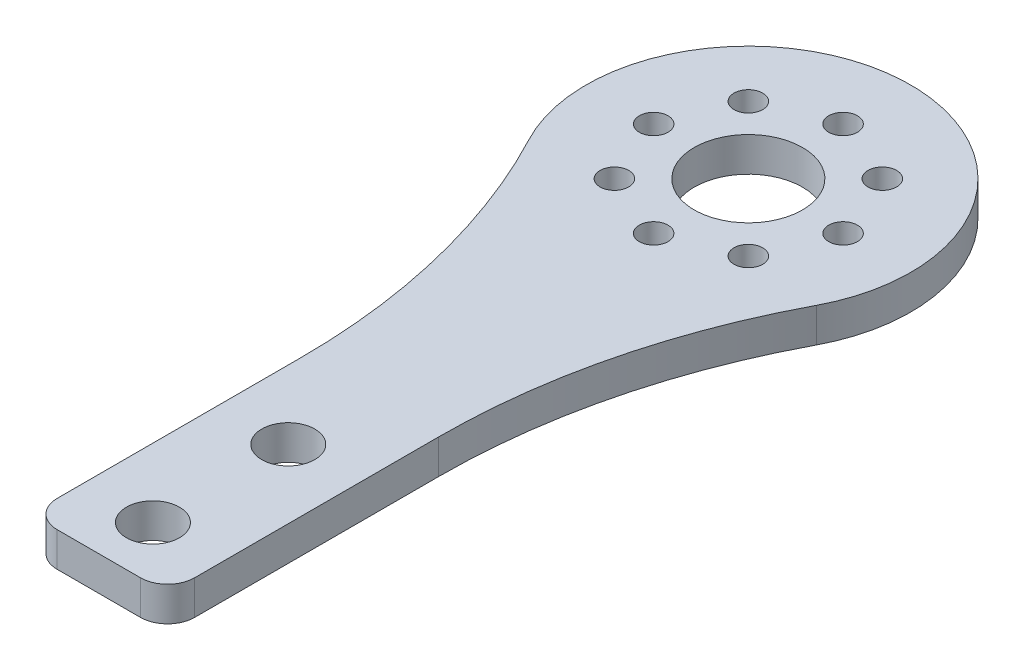
ISO-10303-21;
HEADER;
FILE_DESCRIPTION(('STEP AP214'),'2;1');
FILE_NAME('part.step','',(''),(''),'','','');
FILE_SCHEMA(('AUTOMOTIVE_DESIGN { 1 0 10303 214 1 1 1 1 }'));
ENDSEC;
DATA;
#1=APPLICATION_CONTEXT('core data for automotive mechanical design processes');
#2=APPLICATION_PROTOCOL_DEFINITION('international standard','automotive_design',2000,#1);
#3=PRODUCT_CONTEXT('',#1,'mechanical');
#4=PRODUCT('Part','Part','',(#3));
#5=PRODUCT_RELATED_PRODUCT_CATEGORY('part','',(#4));
#6=PRODUCT_DEFINITION_FORMATION('','',#4);
#7=PRODUCT_DEFINITION_CONTEXT('part definition',#1,'design');
#8=PRODUCT_DEFINITION('design','',#6,#7);
#9=PRODUCT_DEFINITION_SHAPE('','',#8);
#10=(LENGTH_UNIT() NAMED_UNIT(*) SI_UNIT(.MILLI.,.METRE.));
#11=(NAMED_UNIT(*) PLANE_ANGLE_UNIT() SI_UNIT($,.RADIAN.));
#12=(NAMED_UNIT(*) SI_UNIT($,.STERADIAN.) SOLID_ANGLE_UNIT());
#13=UNCERTAINTY_MEASURE_WITH_UNIT(LENGTH_MEASURE(1.E-05),#10,'distance_accuracy_value','');
#14=(GEOMETRIC_REPRESENTATION_CONTEXT(3) GLOBAL_UNCERTAINTY_ASSIGNED_CONTEXT((#13)) GLOBAL_UNIT_ASSIGNED_CONTEXT((#10,
#11,#12)) REPRESENTATION_CONTEXT('',''));
#15=CARTESIAN_POINT('',(0.,0.,0.));
#16=DIRECTION('',(0.,0.,1.));
#17=DIRECTION('',(1.,0.,0.));
#18=AXIS2_PLACEMENT_3D('',#15,#16,#17);
#19=CARTESIAN_POINT('',(0.,0.,0.));
#20=DIRECTION('',(0.,1.,0.));
#21=DIRECTION('',(0.,0.,1.));
#22=AXIS2_PLACEMENT_3D('',#19,#20,#21);
#23=PLANE('',#22);
#24=CARTESIAN_POINT('',(0.,0.,85.));
#25=DIRECTION('',(0.,-1.,0.));
#26=DIRECTION('',(0.,0.,-1.));
#27=AXIS2_PLACEMENT_3D('',#24,#25,#26);
#28=CIRCLE('',#27,4.9022);
#29=CARTESIAN_POINT('',(0.,0.,80.0978));
#30=VERTEX_POINT('',#29);
#31=EDGE_CURVE('E428',#30,#30,#28,.T.);
#32=ORIENTED_EDGE('',*,*,#31,.F.);
#33=EDGE_LOOP('',(#32));
#34=FACE_BOUND('',#33,.T.);
#35=CARTESIAN_POINT('',(0.,0.,110.));
#36=DIRECTION('',(0.,-1.,0.));
#37=DIRECTION('',(0.,0.,-1.));
#38=AXIS2_PLACEMENT_3D('',#35,#36,#37);
#39=CIRCLE('',#38,4.9022);
#40=CARTESIAN_POINT('',(0.,0.,105.0978));
#41=VERTEX_POINT('',#40);
#42=EDGE_CURVE('E430',#41,#41,#39,.T.);
#43=ORIENTED_EDGE('',*,*,#42,.F.);
#44=EDGE_LOOP('',(#43));
#45=FACE_BOUND('',#44,.T.);
#46=CARTESIAN_POINT('',(0.,0.,0.));
#47=DIRECTION('',(0.,-1.,0.));
#48=DIRECTION('',(0.,0.,-1.));
#49=AXIS2_PLACEMENT_3D('',#46,#47,#48);
#50=CIRCLE('',#49,10.);
#51=CARTESIAN_POINT('',(0.,0.,-10.));
#52=VERTEX_POINT('',#51);
#53=EDGE_CURVE('E438',#52,#52,#50,.T.);
#54=ORIENTED_EDGE('',*,*,#53,.F.);
#55=EDGE_LOOP('',(#54));
#56=FACE_BOUND('',#55,.T.);
#57=CARTESIAN_POINT('',(0.,0.,-17.5));
#58=DIRECTION('',(0.,-1.,0.));
#59=DIRECTION('',(0.,0.,-1.));
#60=AXIS2_PLACEMENT_3D('',#57,#58,#59);
#61=CIRCLE('',#60,2.65);
#62=CARTESIAN_POINT('',(0.,0.,-20.15));
#63=VERTEX_POINT('',#62);
#64=EDGE_CURVE('E442',#63,#63,#61,.T.);
#65=ORIENTED_EDGE('',*,*,#64,.F.);
#66=EDGE_LOOP('',(#65));
#67=FACE_BOUND('',#66,.T.);
#68=CARTESIAN_POINT('',(-12.3743686707646,0.,-12.3743686707646));
#69=DIRECTION('',(0.,-1.,0.));
#70=DIRECTION('',(0.,0.,-1.));
#71=AXIS2_PLACEMENT_3D('',#68,#69,#70);
#72=CIRCLE('',#71,2.65);
#73=CARTESIAN_POINT('',(-12.3743686707646,0.,-15.0243686707646));
#74=VERTEX_POINT('',#73);
#75=EDGE_CURVE('E450',#74,#74,#72,.T.);
#76=ORIENTED_EDGE('',*,*,#75,.F.);
#77=EDGE_LOOP('',(#76));
#78=FACE_BOUND('',#77,.T.);
#79=CARTESIAN_POINT('',(-12.3743686707646,0.,12.3743686707646));
#80=DIRECTION('',(0.,-1.,0.));
#81=DIRECTION('',(0.,0.,-1.));
#82=AXIS2_PLACEMENT_3D('',#79,#80,#81);
#83=CIRCLE('',#82,2.65);
#84=CARTESIAN_POINT('',(-12.3743686707646,0.,9.72436867076458));
#85=VERTEX_POINT('',#84);
#86=EDGE_CURVE('E462',#85,#85,#83,.T.);
#87=ORIENTED_EDGE('',*,*,#86,.F.);
#88=EDGE_LOOP('',(#87));
#89=FACE_BOUND('',#88,.T.);
#90=CARTESIAN_POINT('',(0.,0.,17.5));
#91=DIRECTION('',(0.,-1.,0.));
#92=DIRECTION('',(0.,0.,-1.));
#93=AXIS2_PLACEMENT_3D('',#90,#91,#92);
#94=CIRCLE('',#93,2.65);
#95=CARTESIAN_POINT('',(0.,0.,14.85));
#96=VERTEX_POINT('',#95);
#97=EDGE_CURVE('E468',#96,#96,#94,.T.);
#98=ORIENTED_EDGE('',*,*,#97,.F.);
#99=EDGE_LOOP('',(#98));
#100=FACE_BOUND('',#99,.T.);
#101=CARTESIAN_POINT('',(12.3743686707646,0.,12.3743686707646));
#102=DIRECTION('',(0.,-1.,0.));
#103=DIRECTION('',(0.,0.,-1.));
#104=AXIS2_PLACEMENT_3D('',#101,#102,#103);
#105=CIRCLE('',#104,2.65);
#106=CARTESIAN_POINT('',(12.3743686707646,0.,9.72436867076458));
#107=VERTEX_POINT('',#106);
#108=EDGE_CURVE('E474',#107,#107,#105,.T.);
#109=ORIENTED_EDGE('',*,*,#108,.F.);
#110=EDGE_LOOP('',(#109));
#111=FACE_BOUND('',#110,.T.);
#112=CARTESIAN_POINT('',(17.5,0.,0.));
#113=DIRECTION('',(0.,-1.,0.));
#114=DIRECTION('',(0.,0.,-1.));
#115=AXIS2_PLACEMENT_3D('',#112,#113,#114);
#116=CIRCLE('',#115,2.65);
#117=CARTESIAN_POINT('',(17.5,0.,-2.65));
#118=VERTEX_POINT('',#117);
#119=EDGE_CURVE('E480',#118,#118,#116,.T.);
#120=ORIENTED_EDGE('',*,*,#119,.F.);
#121=EDGE_LOOP('',(#120));
#122=FACE_BOUND('',#121,.T.);
#123=CARTESIAN_POINT('',(12.3743686707646,0.,-12.3743686707646));
#124=DIRECTION('',(0.,-1.,0.));
#125=DIRECTION('',(0.,0.,-1.));
#126=AXIS2_PLACEMENT_3D('',#123,#124,#125);
#127=CIRCLE('',#126,2.65);
#128=CARTESIAN_POINT('',(12.3743686707646,0.,-15.0243686707646));
#129=VERTEX_POINT('',#128);
#130=EDGE_CURVE('E486',#129,#129,#127,.T.);
#131=ORIENTED_EDGE('',*,*,#130,.F.);
#132=EDGE_LOOP('',(#131));
#133=FACE_BOUND('',#132,.T.);
#134=DIRECTION('',(0.,0.,-1.));
#135=VECTOR('',#134,1.);
#136=CARTESIAN_POINT('',(12.7,0.,120.));
#137=LINE('',#136,#135);
#138=CARTESIAN_POINT('',(12.7,0.,115.));
#139=VERTEX_POINT('',#138);
#140=CARTESIAN_POINT('',(12.7,0.,69.9336113753609));
#141=VERTEX_POINT('',#140);
#142=EDGE_CURVE('E172',#139,#141,#137,.T.);
#143=ORIENTED_EDGE('',*,*,#142,.F.);
#144=CARTESIAN_POINT('',(7.7,0.,115.));
#145=DIRECTION('',(0.,1.,0.));
#146=DIRECTION('',(0.,0.,1.));
#147=AXIS2_PLACEMENT_3D('',#144,#145,#146);
#148=CIRCLE('',#147,5.);
#149=CARTESIAN_POINT('',(7.7,0.,120.));
#150=VERTEX_POINT('',#149);
#151=EDGE_CURVE('E151',#139,#150,#148,.F.);
#152=ORIENTED_EDGE('',*,*,#151,.T.);
#153=DIRECTION('',(1.,0.,0.));
#154=VECTOR('',#153,1.);
#155=CARTESIAN_POINT('',(-12.7,0.,120.));
#156=LINE('',#155,#154);
#157=CARTESIAN_POINT('',(-7.7,0.,120.));
#158=VERTEX_POINT('',#157);
#159=EDGE_CURVE('E114',#158,#150,#156,.T.);
#160=ORIENTED_EDGE('',*,*,#159,.F.);
#161=CARTESIAN_POINT('',(-7.7,0.,115.));
#162=DIRECTION('',(0.,1.,0.));
#163=DIRECTION('',(0.,0.,1.));
#164=AXIS2_PLACEMENT_3D('',#161,#162,#163);
#165=CIRCLE('',#164,5.);
#166=CARTESIAN_POINT('',(-12.7,0.,115.));
#167=VERTEX_POINT('',#166);
#168=EDGE_CURVE('E112',#158,#167,#165,.F.);
#169=ORIENTED_EDGE('',*,*,#168,.T.);
#170=DIRECTION('',(0.,0.,-1.));
#171=VECTOR('',#170,1.);
#172=CARTESIAN_POINT('',(-12.7,0.,120.));
#173=LINE('',#172,#171);
#174=CARTESIAN_POINT('',(-12.7,0.,69.9336113753609));
#175=VERTEX_POINT('',#174);
#176=EDGE_CURVE('E104',#167,#175,#173,.T.);
#177=ORIENTED_EDGE('',*,*,#176,.T.);
#178=CARTESIAN_POINT('',(-132.7,0.,69.9336113753609));
#179=DIRECTION('',(0.,1.,0.));
#180=DIRECTION('',(0.,0.,1.));
#181=AXIS2_PLACEMENT_3D('',#178,#179,#180);
#182=CIRCLE('',#181,120.);
#183=CARTESIAN_POINT('',(-26.54,0.,13.9867222750722));
#184=VERTEX_POINT('',#183);
#185=EDGE_CURVE('E109',#175,#184,#182,.T.);
#186=ORIENTED_EDGE('',*,*,#185,.T.);
#187=CARTESIAN_POINT('',(0.,0.,0.));
#188=DIRECTION('',(0.,1.,0.));
#189=DIRECTION('',(0.,0.,1.));
#190=AXIS2_PLACEMENT_3D('',#187,#188,#189);
#191=CIRCLE('',#190,30.);
#192=CARTESIAN_POINT('',(26.54,0.,13.9867222750722));
#193=VERTEX_POINT('',#192);
#194=EDGE_CURVE('E115',#193,#184,#191,.T.);
#195=ORIENTED_EDGE('',*,*,#194,.F.);
#196=CARTESIAN_POINT('',(132.7,0.,69.9336113753609));
#197=DIRECTION('',(0.,1.,0.));
#198=DIRECTION('',(0.,0.,1.));
#199=AXIS2_PLACEMENT_3D('',#196,#197,#198);
#200=CIRCLE('',#199,120.);
#201=EDGE_CURVE('E142',#193,#141,#200,.T.);
#202=ORIENTED_EDGE('',*,*,#201,.T.);
#203=EDGE_LOOP('',(#143,#152,#160,#169,#177,#186,#195,#202));
#204=FACE_BOUND('',#203,.T.);
#205=CARTESIAN_POINT('',(-17.5,0.,0.));
#206=DIRECTION('',(0.,-1.,0.));
#207=DIRECTION('',(0.,0.,-1.));
#208=AXIS2_PLACEMENT_3D('',#205,#206,#207);
#209=CIRCLE('',#208,2.65);
#210=CARTESIAN_POINT('',(-17.5,0.,-2.65));
#211=VERTEX_POINT('',#210);
#212=EDGE_CURVE('E456',#211,#211,#209,.T.);
#213=ORIENTED_EDGE('',*,*,#212,.F.);
#214=EDGE_LOOP('',(#213));
#215=FACE_BOUND('',#214,.T.);
#216=ADVANCED_FACE('F40',(#34,#45,#56,#67,#78,#89,#100,#111,#122,#133,#204,#215),#23,.F.);
#217=CARTESIAN_POINT('',(12.7,6.35,120.));
#218=DIRECTION('',(-1.,0.,0.));
#219=DIRECTION('',(0.,0.,1.));
#220=AXIS2_PLACEMENT_3D('',#217,#218,#219);
#221=PLANE('',#220);
#222=DIRECTION('',(0.,0.,-1.));
#223=VECTOR('',#222,1.);
#224=CARTESIAN_POINT('',(12.7,6.35,120.));
#225=LINE('',#224,#223);
#226=CARTESIAN_POINT('',(12.7,6.35,115.));
#227=VERTEX_POINT('',#226);
#228=CARTESIAN_POINT('',(12.7,6.35,69.9336113753609));
#229=VERTEX_POINT('',#228);
#230=EDGE_CURVE('E162',#227,#229,#225,.T.);
#231=ORIENTED_EDGE('',*,*,#230,.F.);
#232=DIRECTION('',(0.,-1.,0.));
#233=VECTOR('',#232,1.);
#234=CARTESIAN_POINT('',(12.7,6.35,115.));
#235=LINE('',#234,#233);
#236=EDGE_CURVE('E147',#227,#139,#235,.T.);
#237=ORIENTED_EDGE('',*,*,#236,.T.);
#238=ORIENTED_EDGE('',*,*,#142,.T.);
#239=DIRECTION('',(0.,1.,0.));
#240=VECTOR('',#239,1.);
#241=CARTESIAN_POINT('',(12.7,6.35,69.9336113753609));
#242=LINE('',#241,#240);
#243=EDGE_CURVE('E125',#141,#229,#242,.T.);
#244=ORIENTED_EDGE('',*,*,#243,.T.);
#245=EDGE_LOOP('',(#231,#237,#238,#244));
#246=FACE_BOUND('',#245,.T.);
#247=ADVANCED_FACE('F166',(#246),#221,.F.);
#248=CARTESIAN_POINT('',(0.,6.35,0.));
#249=DIRECTION('',(0.,-1.,0.));
#250=DIRECTION('',(0.,0.,-1.));
#251=AXIS2_PLACEMENT_3D('',#248,#249,#250);
#252=CYLINDRICAL_SURFACE('',#251,30.);
#253=ORIENTED_EDGE('',*,*,#194,.T.);
#254=DIRECTION('',(0.,-1.,0.));
#255=VECTOR('',#254,1.);
#256=CARTESIAN_POINT('',(-26.54,6.35,13.9867222750722));
#257=LINE('',#256,#255);
#258=CARTESIAN_POINT('',(-26.54,6.35,13.9867222750722));
#259=VERTEX_POINT('',#258);
#260=EDGE_CURVE('E123',#184,#259,#257,.F.);
#261=ORIENTED_EDGE('',*,*,#260,.T.);
#262=CARTESIAN_POINT('',(0.,6.35,0.));
#263=DIRECTION('',(0.,1.,0.));
#264=DIRECTION('',(0.,0.,1.));
#265=AXIS2_PLACEMENT_3D('',#262,#263,#264);
#266=CIRCLE('',#265,30.);
#267=CARTESIAN_POINT('',(26.54,6.35,13.9867222750722));
#268=VERTEX_POINT('',#267);
#269=EDGE_CURVE('E169',#268,#259,#266,.T.);
#270=ORIENTED_EDGE('',*,*,#269,.F.);
#271=DIRECTION('',(0.,-1.,0.));
#272=VECTOR('',#271,1.);
#273=CARTESIAN_POINT('',(26.54,6.35,13.9867222750722));
#274=LINE('',#273,#272);
#275=EDGE_CURVE('E130',#268,#193,#274,.T.);
#276=ORIENTED_EDGE('',*,*,#275,.T.);
#277=EDGE_LOOP('',(#253,#261,#270,#276));
#278=FACE_BOUND('',#277,.T.);
#279=ADVANCED_FACE('F184',(#278),#252,.T.);
#280=CARTESIAN_POINT('',(-12.7,6.35,120.));
#281=DIRECTION('',(-1.,0.,0.));
#282=DIRECTION('',(0.,0.,1.));
#283=AXIS2_PLACEMENT_3D('',#280,#281,#282);
#284=PLANE('',#283);
#285=ORIENTED_EDGE('',*,*,#176,.F.);
#286=DIRECTION('',(0.,-1.,0.));
#287=VECTOR('',#286,1.);
#288=CARTESIAN_POINT('',(-12.7,6.35,115.));
#289=LINE('',#288,#287);
#290=CARTESIAN_POINT('',(-12.7,6.35,115.));
#291=VERTEX_POINT('',#290);
#292=EDGE_CURVE('E11',#167,#291,#289,.F.);
#293=ORIENTED_EDGE('',*,*,#292,.T.);
#294=DIRECTION('',(0.,0.,-1.));
#295=VECTOR('',#294,1.);
#296=CARTESIAN_POINT('',(-12.7,6.35,120.));
#297=LINE('',#296,#295);
#298=CARTESIAN_POINT('',(-12.7,6.35,69.9336113753609));
#299=VERTEX_POINT('',#298);
#300=EDGE_CURVE('E128',#291,#299,#297,.T.);
#301=ORIENTED_EDGE('',*,*,#300,.T.);
#302=DIRECTION('',(0.,-1.,0.));
#303=VECTOR('',#302,1.);
#304=CARTESIAN_POINT('',(-12.7,6.35,69.9336113753609));
#305=LINE('',#304,#303);
#306=EDGE_CURVE('E122',#299,#175,#305,.T.);
#307=ORIENTED_EDGE('',*,*,#306,.T.);
#308=EDGE_LOOP('',(#285,#293,#301,#307));
#309=FACE_BOUND('',#308,.T.);
#310=ADVANCED_FACE('F127',(#309),#284,.T.);
#311=CARTESIAN_POINT('',(-12.7,6.35,120.));
#312=DIRECTION('',(0.,0.,-1.));
#313=DIRECTION('',(-1.,0.,0.));
#314=AXIS2_PLACEMENT_3D('',#311,#312,#313);
#315=PLANE('',#314);
#316=ORIENTED_EDGE('',*,*,#159,.T.);
#317=DIRECTION('',(0.,-1.,0.));
#318=VECTOR('',#317,1.);
#319=CARTESIAN_POINT('',(7.7,6.35,120.));
#320=LINE('',#319,#318);
#321=CARTESIAN_POINT('',(7.7,6.35,120.));
#322=VERTEX_POINT('',#321);
#323=EDGE_CURVE('E61',#150,#322,#320,.F.);
#324=ORIENTED_EDGE('',*,*,#323,.T.);
#325=DIRECTION('',(1.,0.,0.));
#326=VECTOR('',#325,1.);
#327=CARTESIAN_POINT('',(-12.7,6.35,120.));
#328=LINE('',#327,#326);
#329=CARTESIAN_POINT('',(-7.7,6.35,120.));
#330=VERTEX_POINT('',#329);
#331=EDGE_CURVE('E131',#330,#322,#328,.T.);
#332=ORIENTED_EDGE('',*,*,#331,.F.);
#333=DIRECTION('',(0.,-1.,0.));
#334=VECTOR('',#333,1.);
#335=CARTESIAN_POINT('',(-7.7,0.,120.));
#336=LINE('',#335,#334);
#337=EDGE_CURVE('E153',#330,#158,#336,.T.);
#338=ORIENTED_EDGE('',*,*,#337,.T.);
#339=EDGE_LOOP('',(#316,#324,#332,#338));
#340=FACE_BOUND('',#339,.T.);
#341=ADVANCED_FACE('F173',(#340),#315,.F.);
#342=CARTESIAN_POINT('',(0.,6.35,0.));
#343=DIRECTION('',(0.,1.,0.));
#344=DIRECTION('',(0.,0.,1.));
#345=AXIS2_PLACEMENT_3D('',#342,#343,#344);
#346=PLANE('',#345);
#347=CARTESIAN_POINT('',(0.,6.35,85.));
#348=DIRECTION('',(0.,-1.,0.));
#349=DIRECTION('',(0.,0.,-1.));
#350=AXIS2_PLACEMENT_3D('',#347,#348,#349);
#351=CIRCLE('',#350,4.9022);
#352=CARTESIAN_POINT('',(0.,6.35,80.0978));
#353=VERTEX_POINT('',#352);
#354=EDGE_CURVE('E426',#353,#353,#351,.T.);
#355=ORIENTED_EDGE('',*,*,#354,.T.);
#356=EDGE_LOOP('',(#355));
#357=FACE_BOUND('',#356,.T.);
#358=CARTESIAN_POINT('',(0.,6.35,110.));
#359=DIRECTION('',(0.,-1.,0.));
#360=DIRECTION('',(0.,0.,-1.));
#361=AXIS2_PLACEMENT_3D('',#358,#359,#360);
#362=CIRCLE('',#361,4.9022);
#363=CARTESIAN_POINT('',(0.,6.35,105.0978));
#364=VERTEX_POINT('',#363);
#365=EDGE_CURVE('E435',#364,#364,#362,.T.);
#366=ORIENTED_EDGE('',*,*,#365,.T.);
#367=EDGE_LOOP('',(#366));
#368=FACE_BOUND('',#367,.T.);
#369=CARTESIAN_POINT('',(0.,6.35,0.));
#370=DIRECTION('',(0.,-1.,0.));
#371=DIRECTION('',(0.,0.,-1.));
#372=AXIS2_PLACEMENT_3D('',#369,#370,#371);
#373=CIRCLE('',#372,10.);
#374=CARTESIAN_POINT('',(0.,6.35,-10.));
#375=VERTEX_POINT('',#374);
#376=EDGE_CURVE('E439',#375,#375,#373,.T.);
#377=ORIENTED_EDGE('',*,*,#376,.T.);
#378=EDGE_LOOP('',(#377));
#379=FACE_BOUND('',#378,.T.);
#380=CARTESIAN_POINT('',(0.,6.35,-17.5));
#381=DIRECTION('',(0.,-1.,0.));
#382=DIRECTION('',(0.,0.,-1.));
#383=AXIS2_PLACEMENT_3D('',#380,#381,#382);
#384=CIRCLE('',#383,2.65);
#385=CARTESIAN_POINT('',(0.,6.35,-20.15));
#386=VERTEX_POINT('',#385);
#387=EDGE_CURVE('E447',#386,#386,#384,.T.);
#388=ORIENTED_EDGE('',*,*,#387,.T.);
#389=EDGE_LOOP('',(#388));
#390=FACE_BOUND('',#389,.T.);
#391=CARTESIAN_POINT('',(-12.3743686707646,6.35,-12.3743686707646));
#392=DIRECTION('',(0.,-1.,0.));
#393=DIRECTION('',(0.,0.,-1.));
#394=AXIS2_PLACEMENT_3D('',#391,#392,#393);
#395=CIRCLE('',#394,2.65);
#396=CARTESIAN_POINT('',(-12.3743686707646,6.35,-15.0243686707646));
#397=VERTEX_POINT('',#396);
#398=EDGE_CURVE('E453',#397,#397,#395,.T.);
#399=ORIENTED_EDGE('',*,*,#398,.T.);
#400=EDGE_LOOP('',(#399));
#401=FACE_BOUND('',#400,.T.);
#402=CARTESIAN_POINT('',(-17.5,6.35,0.));
#403=DIRECTION('',(0.,-1.,0.));
#404=DIRECTION('',(0.,0.,-1.));
#405=AXIS2_PLACEMENT_3D('',#402,#403,#404);
#406=CIRCLE('',#405,2.65);
#407=CARTESIAN_POINT('',(-17.5,6.35,-2.65));
#408=VERTEX_POINT('',#407);
#409=EDGE_CURVE('E459',#408,#408,#406,.T.);
#410=ORIENTED_EDGE('',*,*,#409,.T.);
#411=EDGE_LOOP('',(#410));
#412=FACE_BOUND('',#411,.T.);
#413=CARTESIAN_POINT('',(-12.3743686707646,6.35,12.3743686707646));
#414=DIRECTION('',(0.,-1.,0.));
#415=DIRECTION('',(0.,0.,-1.));
#416=AXIS2_PLACEMENT_3D('',#413,#414,#415);
#417=CIRCLE('',#416,2.65);
#418=CARTESIAN_POINT('',(-12.3743686707646,6.35,9.72436867076458));
#419=VERTEX_POINT('',#418);
#420=EDGE_CURVE('E465',#419,#419,#417,.T.);
#421=ORIENTED_EDGE('',*,*,#420,.T.);
#422=EDGE_LOOP('',(#421));
#423=FACE_BOUND('',#422,.T.);
#424=CARTESIAN_POINT('',(0.,6.35,17.5));
#425=DIRECTION('',(0.,-1.,0.));
#426=DIRECTION('',(0.,0.,-1.));
#427=AXIS2_PLACEMENT_3D('',#424,#425,#426);
#428=CIRCLE('',#427,2.65);
#429=CARTESIAN_POINT('',(0.,6.35,14.85));
#430=VERTEX_POINT('',#429);
#431=EDGE_CURVE('E471',#430,#430,#428,.T.);
#432=ORIENTED_EDGE('',*,*,#431,.T.);
#433=EDGE_LOOP('',(#432));
#434=FACE_BOUND('',#433,.T.);
#435=CARTESIAN_POINT('',(12.3743686707646,6.35,12.3743686707646));
#436=DIRECTION('',(0.,-1.,0.));
#437=DIRECTION('',(0.,0.,-1.));
#438=AXIS2_PLACEMENT_3D('',#435,#436,#437);
#439=CIRCLE('',#438,2.65);
#440=CARTESIAN_POINT('',(12.3743686707646,6.35,9.72436867076458));
#441=VERTEX_POINT('',#440);
#442=EDGE_CURVE('E477',#441,#441,#439,.T.);
#443=ORIENTED_EDGE('',*,*,#442,.T.);
#444=EDGE_LOOP('',(#443));
#445=FACE_BOUND('',#444,.T.);
#446=CARTESIAN_POINT('',(17.5,6.35,0.));
#447=DIRECTION('',(0.,-1.,0.));
#448=DIRECTION('',(0.,0.,-1.));
#449=AXIS2_PLACEMENT_3D('',#446,#447,#448);
#450=CIRCLE('',#449,2.65);
#451=CARTESIAN_POINT('',(17.5,6.35,-2.65));
#452=VERTEX_POINT('',#451);
#453=EDGE_CURVE('E483',#452,#452,#450,.T.);
#454=ORIENTED_EDGE('',*,*,#453,.T.);
#455=EDGE_LOOP('',(#454));
#456=FACE_BOUND('',#455,.T.);
#457=CARTESIAN_POINT('',(12.3743686707646,6.35,-12.3743686707646));
#458=DIRECTION('',(0.,-1.,0.));
#459=DIRECTION('',(0.,0.,-1.));
#460=AXIS2_PLACEMENT_3D('',#457,#458,#459);
#461=CIRCLE('',#460,2.65);
#462=CARTESIAN_POINT('',(12.3743686707646,6.35,-15.0243686707646));
#463=VERTEX_POINT('',#462);
#464=EDGE_CURVE('E182',#463,#463,#461,.T.);
#465=ORIENTED_EDGE('',*,*,#464,.T.);
#466=EDGE_LOOP('',(#465));
#467=FACE_BOUND('',#466,.T.);
#468=ORIENTED_EDGE('',*,*,#331,.T.);
#469=CARTESIAN_POINT('',(7.7,6.35,115.));
#470=DIRECTION('',(0.,1.,0.));
#471=DIRECTION('',(0.,0.,1.));
#472=AXIS2_PLACEMENT_3D('',#469,#470,#471);
#473=CIRCLE('',#472,5.);
#474=EDGE_CURVE('E48',#322,#227,#473,.T.);
#475=ORIENTED_EDGE('',*,*,#474,.T.);
#476=ORIENTED_EDGE('',*,*,#230,.T.);
#477=CARTESIAN_POINT('',(132.7,6.35,69.9336113753609));
#478=DIRECTION('',(0.,1.,0.));
#479=DIRECTION('',(0.,0.,1.));
#480=AXIS2_PLACEMENT_3D('',#477,#478,#479);
#481=CIRCLE('',#480,120.);
#482=EDGE_CURVE('E145',#229,#268,#481,.F.);
#483=ORIENTED_EDGE('',*,*,#482,.T.);
#484=ORIENTED_EDGE('',*,*,#269,.T.);
#485=CARTESIAN_POINT('',(-132.7,6.35,69.9336113753609));
#486=DIRECTION('',(0.,1.,0.));
#487=DIRECTION('',(0.,0.,1.));
#488=AXIS2_PLACEMENT_3D('',#485,#486,#487);
#489=CIRCLE('',#488,120.);
#490=EDGE_CURVE('E124',#259,#299,#489,.F.);
#491=ORIENTED_EDGE('',*,*,#490,.T.);
#492=ORIENTED_EDGE('',*,*,#300,.F.);
#493=CARTESIAN_POINT('',(-7.7,6.35,115.));
#494=DIRECTION('',(0.,1.,0.));
#495=DIRECTION('',(0.,0.,1.));
#496=AXIS2_PLACEMENT_3D('',#493,#494,#495);
#497=CIRCLE('',#496,5.);
#498=EDGE_CURVE('E157',#291,#330,#497,.T.);
#499=ORIENTED_EDGE('',*,*,#498,.T.);
#500=EDGE_LOOP('',(#468,#475,#476,#483,#484,#491,#492,#499));
#501=FACE_BOUND('',#500,.T.);
#502=ADVANCED_FACE('F161',(#357,#368,#379,#390,#401,#412,#423,#434,#445,#456,#467,#501),#346,.T.);
#503=CARTESIAN_POINT('',(12.3743686707646,0.,-12.3743686707646));
#504=DIRECTION('',(0.,-1.,0.));
#505=DIRECTION('',(0.,0.,-1.));
#506=AXIS2_PLACEMENT_3D('',#503,#504,#505);
#507=CYLINDRICAL_SURFACE('',#506,2.65);
#508=ORIENTED_EDGE('',*,*,#464,.F.);
#509=EDGE_LOOP('',(#508));
#510=FACE_BOUND('',#509,.T.);
#511=ORIENTED_EDGE('',*,*,#130,.T.);
#512=EDGE_LOOP('',(#511));
#513=FACE_BOUND('',#512,.T.);
#514=ADVANCED_FACE('F234',(#510,#513),#507,.F.);
#515=CARTESIAN_POINT('',(17.5,0.,0.));
#516=DIRECTION('',(0.,-1.,0.));
#517=DIRECTION('',(0.,0.,-1.));
#518=AXIS2_PLACEMENT_3D('',#515,#516,#517);
#519=CYLINDRICAL_SURFACE('',#518,2.65);
#520=ORIENTED_EDGE('',*,*,#453,.F.);
#521=EDGE_LOOP('',(#520));
#522=FACE_BOUND('',#521,.T.);
#523=ORIENTED_EDGE('',*,*,#119,.T.);
#524=EDGE_LOOP('',(#523));
#525=FACE_BOUND('',#524,.T.);
#526=ADVANCED_FACE('F242',(#522,#525),#519,.F.);
#527=CARTESIAN_POINT('',(12.3743686707646,0.,12.3743686707646));
#528=DIRECTION('',(0.,-1.,0.));
#529=DIRECTION('',(0.,0.,-1.));
#530=AXIS2_PLACEMENT_3D('',#527,#528,#529);
#531=CYLINDRICAL_SURFACE('',#530,2.65);
#532=ORIENTED_EDGE('',*,*,#442,.F.);
#533=EDGE_LOOP('',(#532));
#534=FACE_BOUND('',#533,.T.);
#535=ORIENTED_EDGE('',*,*,#108,.T.);
#536=EDGE_LOOP('',(#535));
#537=FACE_BOUND('',#536,.T.);
#538=ADVANCED_FACE('F249',(#534,#537),#531,.F.);
#539=CARTESIAN_POINT('',(0.,0.,17.5));
#540=DIRECTION('',(0.,-1.,0.));
#541=DIRECTION('',(0.,0.,-1.));
#542=AXIS2_PLACEMENT_3D('',#539,#540,#541);
#543=CYLINDRICAL_SURFACE('',#542,2.65);
#544=ORIENTED_EDGE('',*,*,#431,.F.);
#545=EDGE_LOOP('',(#544));
#546=FACE_BOUND('',#545,.T.);
#547=ORIENTED_EDGE('',*,*,#97,.T.);
#548=EDGE_LOOP('',(#547));
#549=FACE_BOUND('',#548,.T.);
#550=ADVANCED_FACE('F257',(#546,#549),#543,.F.);
#551=CARTESIAN_POINT('',(-12.3743686707646,0.,12.3743686707646));
#552=DIRECTION('',(0.,-1.,0.));
#553=DIRECTION('',(0.,0.,-1.));
#554=AXIS2_PLACEMENT_3D('',#551,#552,#553);
#555=CYLINDRICAL_SURFACE('',#554,2.65);
#556=ORIENTED_EDGE('',*,*,#420,.F.);
#557=EDGE_LOOP('',(#556));
#558=FACE_BOUND('',#557,.T.);
#559=ORIENTED_EDGE('',*,*,#86,.T.);
#560=EDGE_LOOP('',(#559));
#561=FACE_BOUND('',#560,.T.);
#562=ADVANCED_FACE('F265',(#558,#561),#555,.F.);
#563=CARTESIAN_POINT('',(-17.5,0.,0.));
#564=DIRECTION('',(0.,-1.,0.));
#565=DIRECTION('',(0.,0.,-1.));
#566=AXIS2_PLACEMENT_3D('',#563,#564,#565);
#567=CYLINDRICAL_SURFACE('',#566,2.65);
#568=ORIENTED_EDGE('',*,*,#409,.F.);
#569=EDGE_LOOP('',(#568));
#570=FACE_BOUND('',#569,.T.);
#571=ORIENTED_EDGE('',*,*,#212,.T.);
#572=EDGE_LOOP('',(#571));
#573=FACE_BOUND('',#572,.T.);
#574=ADVANCED_FACE('F273',(#570,#573),#567,.F.);
#575=CARTESIAN_POINT('',(-12.3743686707646,0.,-12.3743686707646));
#576=DIRECTION('',(0.,-1.,0.));
#577=DIRECTION('',(0.,0.,-1.));
#578=AXIS2_PLACEMENT_3D('',#575,#576,#577);
#579=CYLINDRICAL_SURFACE('',#578,2.65);
#580=ORIENTED_EDGE('',*,*,#398,.F.);
#581=EDGE_LOOP('',(#580));
#582=FACE_BOUND('',#581,.T.);
#583=ORIENTED_EDGE('',*,*,#75,.T.);
#584=EDGE_LOOP('',(#583));
#585=FACE_BOUND('',#584,.T.);
#586=ADVANCED_FACE('F281',(#582,#585),#579,.F.);
#587=CARTESIAN_POINT('',(0.,0.,-17.5));
#588=DIRECTION('',(0.,-1.,0.));
#589=DIRECTION('',(0.,0.,-1.));
#590=AXIS2_PLACEMENT_3D('',#587,#588,#589);
#591=CYLINDRICAL_SURFACE('',#590,2.65);
#592=ORIENTED_EDGE('',*,*,#387,.F.);
#593=EDGE_LOOP('',(#592));
#594=FACE_BOUND('',#593,.T.);
#595=ORIENTED_EDGE('',*,*,#64,.T.);
#596=EDGE_LOOP('',(#595));
#597=FACE_BOUND('',#596,.T.);
#598=ADVANCED_FACE('F289',(#594,#597),#591,.F.);
#599=CARTESIAN_POINT('',(0.,6.35,0.));
#600=DIRECTION('',(0.,-1.,0.));
#601=DIRECTION('',(0.,0.,-1.));
#602=AXIS2_PLACEMENT_3D('',#599,#600,#601);
#603=CYLINDRICAL_SURFACE('',#602,10.);
#604=ORIENTED_EDGE('',*,*,#376,.F.);
#605=EDGE_LOOP('',(#604));
#606=FACE_BOUND('',#605,.T.);
#607=ORIENTED_EDGE('',*,*,#53,.T.);
#608=EDGE_LOOP('',(#607));
#609=FACE_BOUND('',#608,.T.);
#610=ADVANCED_FACE('F297',(#606,#609),#603,.F.);
#611=CARTESIAN_POINT('',(0.,0.,110.));
#612=DIRECTION('',(0.,-1.,0.));
#613=DIRECTION('',(0.,0.,-1.));
#614=AXIS2_PLACEMENT_3D('',#611,#612,#613);
#615=CYLINDRICAL_SURFACE('',#614,4.9022);
#616=ORIENTED_EDGE('',*,*,#365,.F.);
#617=EDGE_LOOP('',(#616));
#618=FACE_BOUND('',#617,.T.);
#619=ORIENTED_EDGE('',*,*,#42,.T.);
#620=EDGE_LOOP('',(#619));
#621=FACE_BOUND('',#620,.T.);
#622=ADVANCED_FACE('F305',(#618,#621),#615,.F.);
#623=CARTESIAN_POINT('',(0.,0.,85.));
#624=DIRECTION('',(0.,-1.,0.));
#625=DIRECTION('',(0.,0.,-1.));
#626=AXIS2_PLACEMENT_3D('',#623,#624,#625);
#627=CYLINDRICAL_SURFACE('',#626,4.9022);
#628=ORIENTED_EDGE('',*,*,#354,.F.);
#629=EDGE_LOOP('',(#628));
#630=FACE_BOUND('',#629,.T.);
#631=ORIENTED_EDGE('',*,*,#31,.T.);
#632=EDGE_LOOP('',(#631));
#633=FACE_BOUND('',#632,.T.);
#634=ADVANCED_FACE('F195',(#630,#633),#627,.F.);
#635=CARTESIAN_POINT('',(-132.7,6.35,69.9336113753609));
#636=DIRECTION('',(0.,-1.,0.));
#637=DIRECTION('',(0.,0.,-1.));
#638=AXIS2_PLACEMENT_3D('',#635,#636,#637);
#639=CYLINDRICAL_SURFACE('',#638,120.);
#640=ORIENTED_EDGE('',*,*,#490,.F.);
#641=ORIENTED_EDGE('',*,*,#260,.F.);
#642=ORIENTED_EDGE('',*,*,#185,.F.);
#643=ORIENTED_EDGE('',*,*,#306,.F.);
#644=EDGE_LOOP('',(#640,#641,#642,#643));
#645=FACE_BOUND('',#644,.T.);
#646=ADVANCED_FACE('F121',(#645),#639,.F.);
#647=CARTESIAN_POINT('',(132.7,6.35,69.9336113753609));
#648=DIRECTION('',(0.,-1.,0.));
#649=DIRECTION('',(0.,0.,-1.));
#650=AXIS2_PLACEMENT_3D('',#647,#648,#649);
#651=CYLINDRICAL_SURFACE('',#650,120.);
#652=ORIENTED_EDGE('',*,*,#482,.F.);
#653=ORIENTED_EDGE('',*,*,#243,.F.);
#654=ORIENTED_EDGE('',*,*,#201,.F.);
#655=ORIENTED_EDGE('',*,*,#275,.F.);
#656=EDGE_LOOP('',(#652,#653,#654,#655));
#657=FACE_BOUND('',#656,.T.);
#658=ADVANCED_FACE('F188',(#657),#651,.F.);
#659=CARTESIAN_POINT('',(7.7,6.35,115.));
#660=DIRECTION('',(0.,-1.,0.));
#661=DIRECTION('',(0.,0.,-1.));
#662=AXIS2_PLACEMENT_3D('',#659,#660,#661);
#663=CYLINDRICAL_SURFACE('',#662,5.);
#664=ORIENTED_EDGE('',*,*,#474,.F.);
#665=ORIENTED_EDGE('',*,*,#323,.F.);
#666=ORIENTED_EDGE('',*,*,#151,.F.);
#667=ORIENTED_EDGE('',*,*,#236,.F.);
#668=EDGE_LOOP('',(#664,#665,#666,#667));
#669=FACE_BOUND('',#668,.T.);
#670=ADVANCED_FACE('F171',(#669),#663,.T.);
#671=CARTESIAN_POINT('',(-7.7,6.35,115.));
#672=DIRECTION('',(0.,1.,0.));
#673=DIRECTION('',(0.,0.,1.));
#674=AXIS2_PLACEMENT_3D('',#671,#672,#673);
#675=CYLINDRICAL_SURFACE('',#674,5.);
#676=ORIENTED_EDGE('',*,*,#498,.F.);
#677=ORIENTED_EDGE('',*,*,#292,.F.);
#678=ORIENTED_EDGE('',*,*,#168,.F.);
#679=ORIENTED_EDGE('',*,*,#337,.F.);
#680=EDGE_LOOP('',(#676,#677,#678,#679));
#681=FACE_BOUND('',#680,.T.);
#682=ADVANCED_FACE('F42',(#681),#675,.T.);
#683=CLOSED_SHELL('',(#216,#247,#279,#310,#341,#502,#514,#526,#538,#550,#562,#574,#586,#598,
#610,#622,#634,#646,#658,#670,#682));
#684=MANIFOLD_SOLID_BREP('B2',#683);
#685=ADVANCED_BREP_SHAPE_REPRESENTATION('',(#18,#684),#14);
#686=SHAPE_DEFINITION_REPRESENTATION(#9,#685);
ENDSEC;
END-ISO-10303-21;
